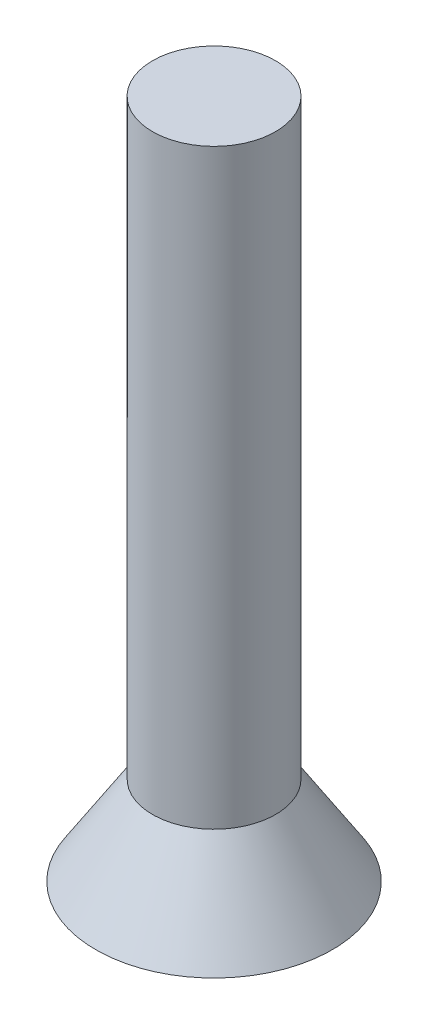
ISO-10303-21;
HEADER;
FILE_DESCRIPTION(('STEP AP214'),'2;1');
FILE_NAME('part.step','',(''),(''),'','','');
FILE_SCHEMA(('AUTOMOTIVE_DESIGN { 1 0 10303 214 1 1 1 1 }'));
ENDSEC;
DATA;
#1=APPLICATION_CONTEXT('core data for automotive mechanical design processes');
#2=APPLICATION_PROTOCOL_DEFINITION('international standard','automotive_design',2000,#1);
#3=PRODUCT_CONTEXT('',#1,'mechanical');
#4=PRODUCT('Part','Part','',(#3));
#5=PRODUCT_RELATED_PRODUCT_CATEGORY('part','',(#4));
#6=PRODUCT_DEFINITION_FORMATION('','',#4);
#7=PRODUCT_DEFINITION_CONTEXT('part definition',#1,'design');
#8=PRODUCT_DEFINITION('design','',#6,#7);
#9=PRODUCT_DEFINITION_SHAPE('','',#8);
#10=(LENGTH_UNIT() NAMED_UNIT(*) SI_UNIT(.MILLI.,.METRE.));
#11=(NAMED_UNIT(*) PLANE_ANGLE_UNIT() SI_UNIT($,.RADIAN.));
#12=(NAMED_UNIT(*) SI_UNIT($,.STERADIAN.) SOLID_ANGLE_UNIT());
#13=UNCERTAINTY_MEASURE_WITH_UNIT(LENGTH_MEASURE(1.E-05),#10,'distance_accuracy_value','');
#14=(GEOMETRIC_REPRESENTATION_CONTEXT(3) GLOBAL_UNCERTAINTY_ASSIGNED_CONTEXT((#13)) GLOBAL_UNIT_ASSIGNED_CONTEXT((#10,
#11,#12)) REPRESENTATION_CONTEXT('',''));
#15=CARTESIAN_POINT('',(0.,0.,0.));
#16=DIRECTION('',(0.,0.,1.));
#17=DIRECTION('',(1.,0.,0.));
#18=AXIS2_PLACEMENT_3D('',#15,#16,#17);
#19=CARTESIAN_POINT('',(0.,0.,0.));
#20=DIRECTION('',(0.,1.,0.));
#21=DIRECTION('',(-1.,0.,0.));
#22=AXIS2_PLACEMENT_3D('',#19,#20,#21);
#23=PLANE('',#22);
#24=CARTESIAN_POINT('',(0.,0.,0.));
#25=DIRECTION('',(0.,1.,0.));
#26=DIRECTION('',(-1.,0.,0.));
#27=AXIS2_PLACEMENT_3D('',#24,#25,#26);
#28=CIRCLE('',#27,3.175);
#29=CARTESIAN_POINT('',(-3.175,0.,0.));
#30=VERTEX_POINT('',#29);
#31=EDGE_CURVE('E10',#30,#30,#28,.T.);
#32=ORIENTED_EDGE('',*,*,#31,.F.);
#33=EDGE_LOOP('',(#32));
#34=FACE_BOUND('',#33,.T.);
#35=ADVANCED_FACE('F39',(#34),#23,.F.);
#36=CARTESIAN_POINT('',(0.,2.38125,0.));
#37=DIRECTION('',(0.,-1.,0.));
#38=DIRECTION('',(1.,0.,0.));
#39=AXIS2_PLACEMENT_3D('',#36,#37,#38);
#40=CONICAL_SURFACE('',#39,1.651,0.569313191100661);
#41=ORIENTED_EDGE('',*,*,#31,.T.);
#42=EDGE_LOOP('',(#41));
#43=FACE_BOUND('',#42,.T.);
#44=CARTESIAN_POINT('',(0.,2.38125,0.));
#45=DIRECTION('',(0.,1.,0.));
#46=DIRECTION('',(-1.,0.,0.));
#47=AXIS2_PLACEMENT_3D('',#44,#45,#46);
#48=CIRCLE('',#47,1.651);
#49=CARTESIAN_POINT('',(-1.651,2.38125,0.));
#50=VERTEX_POINT('',#49);
#51=EDGE_CURVE('E46',#50,#50,#48,.T.);
#52=ORIENTED_EDGE('',*,*,#51,.F.);
#53=EDGE_LOOP('',(#52));
#54=FACE_BOUND('',#53,.T.);
#55=ADVANCED_FACE('F63',(#43,#54),#40,.T.);
#56=CARTESIAN_POINT('',(0.,0.,0.));
#57=DIRECTION('',(0.,1.,0.));
#58=DIRECTION('',(-1.,0.,0.));
#59=AXIS2_PLACEMENT_3D('',#56,#57,#58);
#60=CYLINDRICAL_SURFACE('',#59,1.651);
#61=ORIENTED_EDGE('',*,*,#51,.T.);
#62=EDGE_LOOP('',(#61));
#63=FACE_BOUND('',#62,.T.);
#64=CARTESIAN_POINT('',(0.,18.25625,0.));
#65=DIRECTION('',(0.,1.,0.));
#66=DIRECTION('',(-1.,0.,0.));
#67=AXIS2_PLACEMENT_3D('',#64,#65,#66);
#68=CIRCLE('',#67,1.651);
#69=CARTESIAN_POINT('',(-1.651,18.25625,0.));
#70=VERTEX_POINT('',#69);
#71=EDGE_CURVE('E51',#70,#70,#68,.T.);
#72=ORIENTED_EDGE('',*,*,#71,.F.);
#73=EDGE_LOOP('',(#72));
#74=FACE_BOUND('',#73,.T.);
#75=ADVANCED_FACE('F61',(#63,#74),#60,.T.);
#76=CARTESIAN_POINT('',(0.,18.25625,0.));
#77=DIRECTION('',(0.,1.,0.));
#78=DIRECTION('',(-1.,0.,0.));
#79=AXIS2_PLACEMENT_3D('',#76,#77,#78);
#80=PLANE('',#79);
#81=ORIENTED_EDGE('',*,*,#71,.T.);
#82=EDGE_LOOP('',(#81));
#83=FACE_BOUND('',#82,.T.);
#84=ADVANCED_FACE('F59',(#83),#80,.T.);
#85=CLOSED_SHELL('',(#35,#55,#75,#84));
#86=MANIFOLD_SOLID_BREP('B2',#85);
#87=ADVANCED_BREP_SHAPE_REPRESENTATION('',(#18,#86),#14);
#88=SHAPE_DEFINITION_REPRESENTATION(#9,#87);
ENDSEC;
END-ISO-10303-21;
